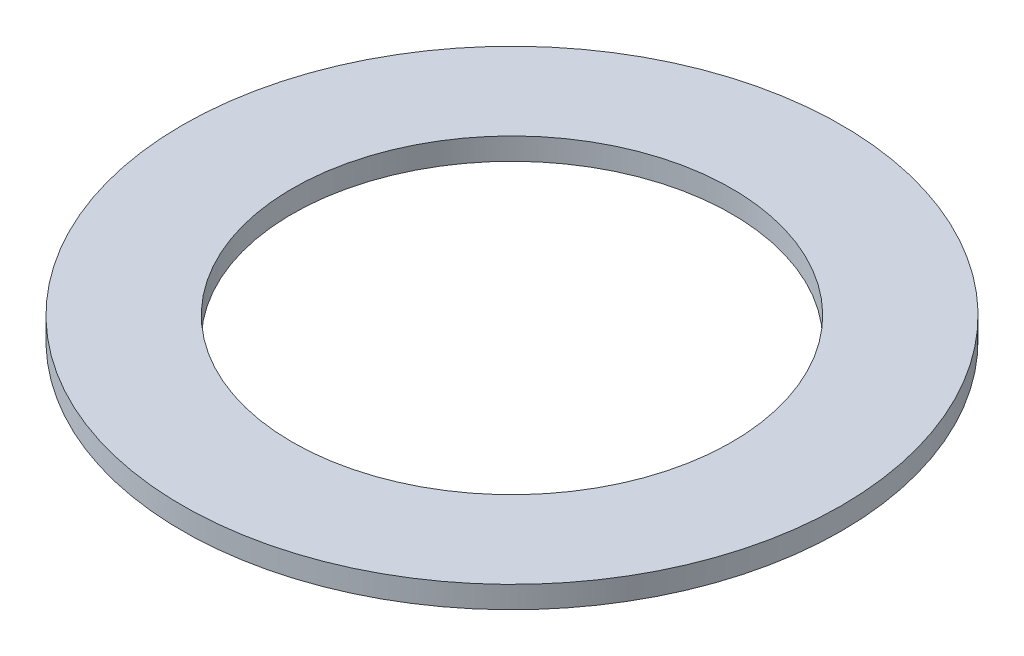
ISO-10303-21;
HEADER;
FILE_DESCRIPTION(('STEP AP214'),'2;1');
FILE_NAME('part.step','',(''),(''),'','','');
FILE_SCHEMA(('AUTOMOTIVE_DESIGN { 1 0 10303 214 1 1 1 1 }'));
ENDSEC;
DATA;
#1=APPLICATION_CONTEXT('core data for automotive mechanical design processes');
#2=APPLICATION_PROTOCOL_DEFINITION('international standard','automotive_design',2000,#1);
#3=PRODUCT_CONTEXT('',#1,'mechanical');
#4=PRODUCT('Part','Part','',(#3));
#5=PRODUCT_RELATED_PRODUCT_CATEGORY('part','',(#4));
#6=PRODUCT_DEFINITION_FORMATION('','',#4);
#7=PRODUCT_DEFINITION_CONTEXT('part definition',#1,'design');
#8=PRODUCT_DEFINITION('design','',#6,#7);
#9=PRODUCT_DEFINITION_SHAPE('','',#8);
#10=(LENGTH_UNIT() NAMED_UNIT(*) SI_UNIT(.MILLI.,.METRE.));
#11=(NAMED_UNIT(*) PLANE_ANGLE_UNIT() SI_UNIT($,.RADIAN.));
#12=(NAMED_UNIT(*) SI_UNIT($,.STERADIAN.) SOLID_ANGLE_UNIT());
#13=UNCERTAINTY_MEASURE_WITH_UNIT(LENGTH_MEASURE(1.E-05),#10,'distance_accuracy_value','');
#14=(GEOMETRIC_REPRESENTATION_CONTEXT(3) GLOBAL_UNCERTAINTY_ASSIGNED_CONTEXT((#13)) GLOBAL_UNIT_ASSIGNED_CONTEXT((#10,
#11,#12)) REPRESENTATION_CONTEXT('',''));
#15=CARTESIAN_POINT('',(0.,0.,0.));
#16=DIRECTION('',(0.,0.,1.));
#17=DIRECTION('',(1.,0.,0.));
#18=AXIS2_PLACEMENT_3D('',#15,#16,#17);
#19=CARTESIAN_POINT('',(0.,1.,0.));
#20=DIRECTION('',(0.,1.,0.));
#21=DIRECTION('',(0.,0.,1.));
#22=AXIS2_PLACEMENT_3D('',#19,#20,#21);
#23=PLANE('',#22);
#24=CARTESIAN_POINT('',(0.,1.,0.));
#25=DIRECTION('',(0.,1.,0.));
#26=DIRECTION('',(1.,0.,0.));
#27=AXIS2_PLACEMENT_3D('',#24,#25,#26);
#28=CIRCLE('',#27,15.);
#29=CARTESIAN_POINT('',(15.,1.,0.));
#30=VERTEX_POINT('',#29);
#31=EDGE_CURVE('E11',#30,#30,#28,.T.);
#32=ORIENTED_EDGE('',*,*,#31,.T.);
#33=EDGE_LOOP('',(#32));
#34=FACE_BOUND('',#33,.T.);
#35=CARTESIAN_POINT('',(0.,1.,0.));
#36=DIRECTION('',(0.,1.,0.));
#37=DIRECTION('',(0.,0.,1.));
#38=AXIS2_PLACEMENT_3D('',#35,#36,#37);
#39=CIRCLE('',#38,10.);
#40=CARTESIAN_POINT('',(0.,1.,10.));
#41=VERTEX_POINT('',#40);
#42=EDGE_CURVE('E49',#41,#41,#39,.T.);
#43=ORIENTED_EDGE('',*,*,#42,.F.);
#44=EDGE_LOOP('',(#43));
#45=FACE_BOUND('',#44,.T.);
#46=ADVANCED_FACE('F38',(#34,#45),#23,.T.);
#47=CARTESIAN_POINT('',(0.,0.,0.));
#48=DIRECTION('',(0.,1.,0.));
#49=DIRECTION('',(0.,0.,1.));
#50=AXIS2_PLACEMENT_3D('',#47,#48,#49);
#51=PLANE('',#50);
#52=CARTESIAN_POINT('',(0.,0.,0.));
#53=DIRECTION('',(0.,1.,0.));
#54=DIRECTION('',(1.,0.,0.));
#55=AXIS2_PLACEMENT_3D('',#52,#53,#54);
#56=CIRCLE('',#55,15.);
#57=CARTESIAN_POINT('',(15.,0.,0.));
#58=VERTEX_POINT('',#57);
#59=EDGE_CURVE('E42',#58,#58,#56,.T.);
#60=ORIENTED_EDGE('',*,*,#59,.F.);
#61=EDGE_LOOP('',(#60));
#62=FACE_BOUND('',#61,.T.);
#63=CARTESIAN_POINT('',(0.,0.,0.));
#64=DIRECTION('',(0.,1.,0.));
#65=DIRECTION('',(0.,0.,1.));
#66=AXIS2_PLACEMENT_3D('',#63,#64,#65);
#67=CIRCLE('',#66,10.);
#68=CARTESIAN_POINT('',(0.,0.,10.));
#69=VERTEX_POINT('',#68);
#70=EDGE_CURVE('E51',#69,#69,#67,.T.);
#71=ORIENTED_EDGE('',*,*,#70,.T.);
#72=EDGE_LOOP('',(#71));
#73=FACE_BOUND('',#72,.T.);
#74=ADVANCED_FACE('F61',(#62,#73),#51,.F.);
#75=CARTESIAN_POINT('',(0.,1.,0.));
#76=DIRECTION('',(0.,-1.,0.));
#77=DIRECTION('',(0.,0.,-1.));
#78=AXIS2_PLACEMENT_3D('',#75,#76,#77);
#79=CYLINDRICAL_SURFACE('',#78,15.);
#80=ORIENTED_EDGE('',*,*,#31,.F.);
#81=EDGE_LOOP('',(#80));
#82=FACE_BOUND('',#81,.T.);
#83=ORIENTED_EDGE('',*,*,#59,.T.);
#84=EDGE_LOOP('',(#83));
#85=FACE_BOUND('',#84,.T.);
#86=ADVANCED_FACE('F40',(#82,#85),#79,.T.);
#87=CARTESIAN_POINT('',(0.,1.,0.));
#88=DIRECTION('',(0.,-1.,0.));
#89=DIRECTION('',(0.,0.,-1.));
#90=AXIS2_PLACEMENT_3D('',#87,#88,#89);
#91=CYLINDRICAL_SURFACE('',#90,10.);
#92=ORIENTED_EDGE('',*,*,#42,.T.);
#93=EDGE_LOOP('',(#92));
#94=FACE_BOUND('',#93,.T.);
#95=ORIENTED_EDGE('',*,*,#70,.F.);
#96=EDGE_LOOP('',(#95));
#97=FACE_BOUND('',#96,.T.);
#98=ADVANCED_FACE('F57',(#94,#97),#91,.F.);
#99=CLOSED_SHELL('',(#46,#74,#86,#98));
#100=MANIFOLD_SOLID_BREP('B2',#99);
#101=ADVANCED_BREP_SHAPE_REPRESENTATION('',(#18,#100),#14);
#102=SHAPE_DEFINITION_REPRESENTATION(#9,#101);
ENDSEC;
END-ISO-10303-21;
